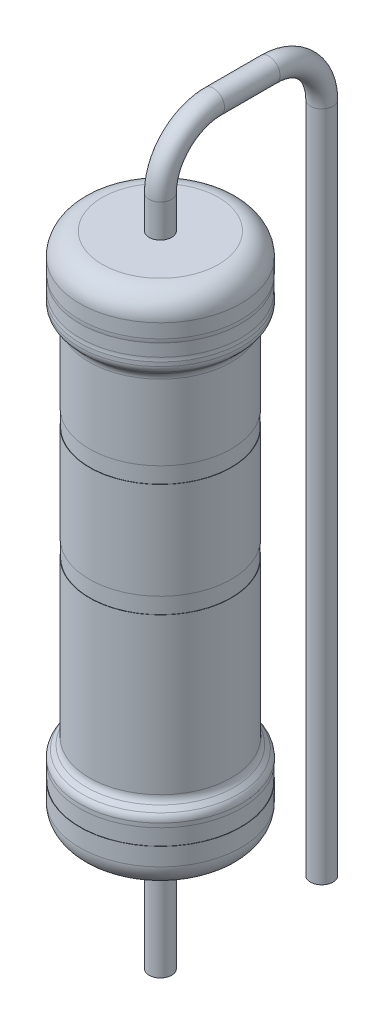
ISO-10303-21;
HEADER;
FILE_DESCRIPTION(('STEP AP214'),'2;1');
FILE_NAME('part.step','',(''),(''),'','','');
FILE_SCHEMA(('AUTOMOTIVE_DESIGN { 1 0 10303 214 1 1 1 1 }'));
ENDSEC;
DATA;
#1=APPLICATION_CONTEXT('core data for automotive mechanical design processes');
#2=APPLICATION_PROTOCOL_DEFINITION('international standard','automotive_design',2000,#1);
#3=PRODUCT_CONTEXT('',#1,'mechanical');
#4=PRODUCT('Part','Part','',(#3));
#5=PRODUCT_RELATED_PRODUCT_CATEGORY('part','',(#4));
#6=PRODUCT_DEFINITION_FORMATION('','',#4);
#7=PRODUCT_DEFINITION_CONTEXT('part definition',#1,'design');
#8=PRODUCT_DEFINITION('design','',#6,#7);
#9=PRODUCT_DEFINITION_SHAPE('','',#8);
#10=(LENGTH_UNIT() NAMED_UNIT(*) SI_UNIT(.MILLI.,.METRE.));
#11=(NAMED_UNIT(*) PLANE_ANGLE_UNIT() SI_UNIT($,.RADIAN.));
#12=(NAMED_UNIT(*) SI_UNIT($,.STERADIAN.) SOLID_ANGLE_UNIT());
#13=UNCERTAINTY_MEASURE_WITH_UNIT(LENGTH_MEASURE(1.E-05),#10,'distance_accuracy_value','');
#14=(GEOMETRIC_REPRESENTATION_CONTEXT(3) GLOBAL_UNCERTAINTY_ASSIGNED_CONTEXT((#13)) GLOBAL_UNIT_ASSIGNED_CONTEXT((#10,
#11,#12)) REPRESENTATION_CONTEXT('',''));
#15=CARTESIAN_POINT('',(0.,0.,0.));
#16=DIRECTION('',(0.,0.,1.));
#17=DIRECTION('',(1.,0.,0.));
#18=AXIS2_PLACEMENT_3D('',#15,#16,#17);
#19=CARTESIAN_POINT('',(0.,-3.8,-5.));
#20=DIRECTION('',(0.,-1.,0.));
#21=DIRECTION('',(0.,0.,-1.));
#22=AXIS2_PLACEMENT_3D('',#19,#20,#21);
#23=PLANE('',#22);
#24=CARTESIAN_POINT('',(0.,-3.8,-5.));
#25=DIRECTION('',(0.,-1.,0.));
#26=DIRECTION('',(0.,0.,-1.));
#27=AXIS2_PLACEMENT_3D('',#24,#25,#26);
#28=CIRCLE('',#27,0.35);
#29=CARTESIAN_POINT('',(0.,-3.8,-5.35));
#30=VERTEX_POINT('',#29);
#31=EDGE_CURVE('E297',#30,#30,#28,.F.);
#32=ORIENTED_EDGE('',*,*,#31,.F.);
#33=EDGE_LOOP('',(#32));
#34=FACE_BOUND('',#33,.T.);
#35=ADVANCED_FACE('F17',(#34),#23,.T.);
#36=CARTESIAN_POINT('',(0.,17.02,-5.));
#37=DIRECTION('',(0.,-1.,0.));
#38=DIRECTION('',(0.,0.,-1.));
#39=AXIS2_PLACEMENT_3D('',#36,#37,#38);
#40=CYLINDRICAL_SURFACE('',#39,0.35);
#41=ORIENTED_EDGE('',*,*,#31,.T.);
#42=EDGE_LOOP('',(#41));
#43=FACE_BOUND('',#42,.T.);
#44=CARTESIAN_POINT('',(0.,17.02,-5.));
#45=DIRECTION('',(0.,-1.,0.));
#46=DIRECTION('',(0.,0.,-1.));
#47=AXIS2_PLACEMENT_3D('',#44,#45,#46);
#48=CIRCLE('',#47,0.35);
#49=CARTESIAN_POINT('',(0.,17.02,-5.35));
#50=VERTEX_POINT('',#49);
#51=EDGE_CURVE('E299',#50,#50,#48,.F.);
#52=ORIENTED_EDGE('',*,*,#51,.F.);
#53=EDGE_LOOP('',(#52));
#54=FACE_BOUND('',#53,.T.);
#55=ADVANCED_FACE('F571',(#43,#54),#40,.T.);
#56=CARTESIAN_POINT('',(0.,17.02,-3.36));
#57=DIRECTION('',(-1.,0.,0.));
#58=DIRECTION('',(0.,0.,1.));
#59=AXIS2_PLACEMENT_3D('',#56,#57,#58);
#60=TOROIDAL_SURFACE('',#59,1.64,0.35);
#61=ORIENTED_EDGE('',*,*,#51,.T.);
#62=EDGE_LOOP('',(#61));
#63=FACE_BOUND('',#62,.T.);
#64=CARTESIAN_POINT('',(0.,18.66,-3.36));
#65=DIRECTION('',(0.,0.,-1.));
#66=DIRECTION('',(-1.,0.,0.));
#67=AXIS2_PLACEMENT_3D('',#64,#65,#66);
#68=CIRCLE('',#67,0.35);
#69=CARTESIAN_POINT('',(-0.35,18.66,-3.36));
#70=VERTEX_POINT('',#69);
#71=EDGE_CURVE('E311',#70,#70,#68,.F.);
#72=ORIENTED_EDGE('',*,*,#71,.F.);
#73=EDGE_LOOP('',(#72));
#74=FACE_BOUND('',#73,.T.);
#75=ADVANCED_FACE('F561',(#63,#74),#60,.T.);
#76=CARTESIAN_POINT('',(0.,18.66,-1.64));
#77=DIRECTION('',(0.,0.,-1.));
#78=DIRECTION('',(-1.,0.,0.));
#79=AXIS2_PLACEMENT_3D('',#76,#77,#78);
#80=CYLINDRICAL_SURFACE('',#79,0.35);
#81=CARTESIAN_POINT('',(0.,18.66,-1.64));
#82=DIRECTION('',(0.,0.,-1.));
#83=DIRECTION('',(0.,1.,0.));
#84=AXIS2_PLACEMENT_3D('',#81,#82,#83);
#85=CIRCLE('',#84,0.35);
#86=CARTESIAN_POINT('',(0.,19.01,-1.64));
#87=VERTEX_POINT('',#86);
#88=EDGE_CURVE('E316',#87,#87,#85,.F.);
#89=ORIENTED_EDGE('',*,*,#88,.F.);
#90=EDGE_LOOP('',(#89));
#91=FACE_BOUND('',#90,.T.);
#92=ORIENTED_EDGE('',*,*,#71,.T.);
#93=EDGE_LOOP('',(#92));
#94=FACE_BOUND('',#93,.T.);
#95=ADVANCED_FACE('F551',(#91,#94),#80,.T.);
#96=CARTESIAN_POINT('',(0.,17.02,-1.64));
#97=DIRECTION('',(-1.,0.,0.));
#98=DIRECTION('',(0.,0.,1.));
#99=AXIS2_PLACEMENT_3D('',#96,#97,#98);
#100=TOROIDAL_SURFACE('',#99,1.64,0.35);
#101=CARTESIAN_POINT('',(0.,17.02,0.));
#102=DIRECTION('',(0.,-1.,0.));
#103=DIRECTION('',(0.,0.,-1.));
#104=AXIS2_PLACEMENT_3D('',#101,#102,#103);
#105=CIRCLE('',#104,0.35);
#106=CARTESIAN_POINT('',(0.,17.02,-0.35));
#107=VERTEX_POINT('',#106);
#108=EDGE_CURVE('E66',#107,#107,#105,.T.);
#109=ORIENTED_EDGE('',*,*,#108,.F.);
#110=EDGE_LOOP('',(#109));
#111=FACE_BOUND('',#110,.T.);
#112=ORIENTED_EDGE('',*,*,#88,.T.);
#113=EDGE_LOOP('',(#112));
#114=FACE_BOUND('',#113,.T.);
#115=ADVANCED_FACE('F542',(#111,#114),#100,.T.);
#116=CARTESIAN_POINT('',(0.,17.02,0.));
#117=DIRECTION('',(0.,-1.,0.));
#118=DIRECTION('',(0.,0.,-1.));
#119=AXIS2_PLACEMENT_3D('',#116,#117,#118);
#120=CYLINDRICAL_SURFACE('',#119,0.35);
#121=CARTESIAN_POINT('',(0.,16.,0.));
#122=DIRECTION('',(0.,-1.,0.));
#123=DIRECTION('',(0.,0.,-1.));
#124=AXIS2_PLACEMENT_3D('',#121,#122,#123);
#125=CIRCLE('',#124,0.35);
#126=CARTESIAN_POINT('',(0.,16.,-0.35));
#127=VERTEX_POINT('',#126);
#128=EDGE_CURVE('E52',#127,#127,#125,.T.);
#129=ORIENTED_EDGE('',*,*,#128,.F.);
#130=EDGE_LOOP('',(#129));
#131=FACE_BOUND('',#130,.T.);
#132=ORIENTED_EDGE('',*,*,#108,.T.);
#133=EDGE_LOOP('',(#132));
#134=FACE_BOUND('',#133,.T.);
#135=ADVANCED_FACE('F533',(#131,#134),#120,.T.);
#136=CARTESIAN_POINT('',(0.,16.,0.));
#137=DIRECTION('',(0.,1.,0.));
#138=DIRECTION('',(0.,0.,1.));
#139=AXIS2_PLACEMENT_3D('',#136,#137,#138);
#140=PLANE('',#139);
#141=ORIENTED_EDGE('',*,*,#128,.T.);
#142=EDGE_LOOP('',(#141));
#143=FACE_BOUND('',#142,.T.);
#144=CARTESIAN_POINT('',(0.,16.,0.));
#145=DIRECTION('',(0.,-1.,0.));
#146=DIRECTION('',(0.,0.,-1.));
#147=AXIS2_PLACEMENT_3D('',#144,#145,#146);
#148=CIRCLE('',#147,1.8);
#149=CARTESIAN_POINT('',(0.,16.,-1.8));
#150=VERTEX_POINT('',#149);
#151=CARTESIAN_POINT('',(0.,16.,1.8));
#152=VERTEX_POINT('',#151);
#153=EDGE_CURVE('E45',#150,#152,#148,.T.);
#154=ORIENTED_EDGE('',*,*,#153,.F.);
#155=CARTESIAN_POINT('',(0.,16.,0.));
#156=DIRECTION('',(0.,-1.,0.));
#157=DIRECTION('',(0.,0.,1.));
#158=AXIS2_PLACEMENT_3D('',#155,#156,#157);
#159=CIRCLE('',#158,1.8);
#160=EDGE_CURVE('E50',#152,#150,#159,.T.);
#161=ORIENTED_EDGE('',*,*,#160,.F.);
#162=EDGE_LOOP('',(#154,#161));
#163=FACE_BOUND('',#162,.T.);
#164=ADVANCED_FACE('F49',(#143,#163),#140,.T.);
#165=CARTESIAN_POINT('',(0.,15.3,0.));
#166=DIRECTION('',(0.,1.,0.));
#167=DIRECTION('',(0.,0.,1.));
#168=AXIS2_PLACEMENT_3D('',#165,#166,#167);
#169=TOROIDAL_SURFACE('',#168,1.8,0.7);
#170=CARTESIAN_POINT('',(0.,15.3,0.));
#171=DIRECTION('',(0.,-1.,0.));
#172=DIRECTION('',(0.,0.,-1.));
#173=AXIS2_PLACEMENT_3D('',#170,#171,#172);
#174=CIRCLE('',#173,2.5);
#175=CARTESIAN_POINT('',(0.,15.3,-2.5));
#176=VERTEX_POINT('',#175);
#177=EDGE_CURVE('E57',#176,#176,#174,.T.);
#178=ORIENTED_EDGE('',*,*,#177,.F.);
#179=EDGE_LOOP('',(#178));
#180=FACE_BOUND('',#179,.T.);
#181=ORIENTED_EDGE('',*,*,#160,.T.);
#182=ORIENTED_EDGE('',*,*,#153,.T.);
#183=EDGE_LOOP('',(#181,#182));
#184=FACE_BOUND('',#183,.T.);
#185=ADVANCED_FACE('F56',(#180,#184),#169,.T.);
#186=CARTESIAN_POINT('',(0.,16.,0.));
#187=DIRECTION('',(0.,-1.,0.));
#188=DIRECTION('',(0.,0.,-1.));
#189=AXIS2_PLACEMENT_3D('',#186,#187,#188);
#190=CYLINDRICAL_SURFACE('',#189,2.5);
#191=ORIENTED_EDGE('',*,*,#177,.T.);
#192=EDGE_LOOP('',(#191));
#193=FACE_BOUND('',#192,.T.);
#194=CARTESIAN_POINT('',(0.,14.8678982612255,0.));
#195=DIRECTION('',(0.,-1.,0.));
#196=DIRECTION('',(0.,0.,-1.));
#197=AXIS2_PLACEMENT_3D('',#194,#195,#196);
#198=CIRCLE('',#197,2.5);
#199=CARTESIAN_POINT('',(0.,14.8678982612255,-2.5));
#200=VERTEX_POINT('',#199);
#201=EDGE_CURVE('E86',#200,#200,#198,.T.);
#202=ORIENTED_EDGE('',*,*,#201,.F.);
#203=EDGE_LOOP('',(#202));
#204=FACE_BOUND('',#203,.T.);
#205=ADVANCED_FACE('F76',(#193,#204),#190,.T.);
#206=CARTESIAN_POINT('',(0.,14.8678982612255,0.));
#207=DIRECTION('',(0.,-1.,0.));
#208=DIRECTION('',(0.,0.,-1.));
#209=AXIS2_PLACEMENT_3D('',#206,#207,#208);
#210=TOROIDAL_SURFACE('',#209,1.8,0.7);
#211=ORIENTED_EDGE('',*,*,#201,.T.);
#212=EDGE_LOOP('',(#211));
#213=FACE_BOUND('',#212,.T.);
#214=CARTESIAN_POINT('',(0.,14.75,0.));
#215=DIRECTION('',(0.,-1.,0.));
#216=DIRECTION('',(0.,0.,-1.));
#217=AXIS2_PLACEMENT_3D('',#214,#215,#216);
#218=CIRCLE('',#217,2.49);
#219=CARTESIAN_POINT('',(0.,14.75,-2.49));
#220=VERTEX_POINT('',#219);
#221=EDGE_CURVE('E89',#220,#220,#218,.T.);
#222=ORIENTED_EDGE('',*,*,#221,.F.);
#223=EDGE_LOOP('',(#222));
#224=FACE_BOUND('',#223,.T.);
#225=ADVANCED_FACE('F93',(#213,#224),#210,.T.);
#226=CARTESIAN_POINT('',(0.,0.,0.));
#227=DIRECTION('',(0.,-1.,0.));
#228=DIRECTION('',(0.,0.,-1.));
#229=AXIS2_PLACEMENT_3D('',#226,#227,#228);
#230=CYLINDRICAL_SURFACE('',#229,2.49);
#231=ORIENTED_EDGE('',*,*,#221,.T.);
#232=EDGE_LOOP('',(#231));
#233=FACE_BOUND('',#232,.T.);
#234=CARTESIAN_POINT('',(0.,14.3678982612255,0.));
#235=DIRECTION('',(0.,-1.,0.));
#236=DIRECTION('',(0.,0.,-1.));
#237=AXIS2_PLACEMENT_3D('',#234,#235,#236);
#238=CIRCLE('',#237,2.49);
#239=CARTESIAN_POINT('',(0.,14.3678982612255,-2.49));
#240=VERTEX_POINT('',#239);
#241=EDGE_CURVE('E112',#240,#240,#238,.F.);
#242=ORIENTED_EDGE('',*,*,#241,.T.);
#243=EDGE_LOOP('',(#242));
#244=FACE_BOUND('',#243,.T.);
#245=ADVANCED_FACE('F96',(#233,#244),#230,.T.);
#246=CARTESIAN_POINT('',(0.,14.3678982612255,0.));
#247=DIRECTION('',(0.,-1.,0.));
#248=DIRECTION('',(0.,0.,-1.));
#249=AXIS2_PLACEMENT_3D('',#246,#247,#248);
#250=TOROIDAL_SURFACE('',#249,3.19,0.7);
#251=ORIENTED_EDGE('',*,*,#241,.F.);
#252=EDGE_LOOP('',(#251));
#253=FACE_BOUND('',#252,.T.);
#254=CARTESIAN_POINT('',(0.,14.25,0.));
#255=DIRECTION('',(0.,-1.,0.));
#256=DIRECTION('',(0.,0.,-1.));
#257=AXIS2_PLACEMENT_3D('',#254,#255,#256);
#258=CIRCLE('',#257,2.5);
#259=CARTESIAN_POINT('',(0.,14.25,-2.5));
#260=VERTEX_POINT('',#259);
#261=EDGE_CURVE('E110',#260,#260,#258,.T.);
#262=ORIENTED_EDGE('',*,*,#261,.F.);
#263=EDGE_LOOP('',(#262));
#264=FACE_BOUND('',#263,.T.);
#265=ADVANCED_FACE('F100',(#253,#264),#250,.F.);
#266=CARTESIAN_POINT('',(0.,16.,0.));
#267=DIRECTION('',(0.,-1.,0.));
#268=DIRECTION('',(0.,0.,-1.));
#269=AXIS2_PLACEMENT_3D('',#266,#267,#268);
#270=CYLINDRICAL_SURFACE('',#269,2.5);
#271=ORIENTED_EDGE('',*,*,#261,.T.);
#272=EDGE_LOOP('',(#271));
#273=FACE_BOUND('',#272,.T.);
#274=CARTESIAN_POINT('',(0.,14.1242640687119,0.));
#275=DIRECTION('',(0.,1.,0.));
#276=DIRECTION('',(0.,0.,1.));
#277=AXIS2_PLACEMENT_3D('',#274,#275,#276);
#278=CIRCLE('',#277,2.5);
#279=CARTESIAN_POINT('',(0.,14.1242640687119,2.5));
#280=VERTEX_POINT('',#279);
#281=EDGE_CURVE('E117',#280,#280,#278,.F.);
#282=ORIENTED_EDGE('',*,*,#281,.F.);
#283=EDGE_LOOP('',(#282));
#284=FACE_BOUND('',#283,.T.);
#285=ADVANCED_FACE('F105',(#273,#284),#270,.T.);
#286=CARTESIAN_POINT('',(0.,-3.8,-5.));
#287=DIRECTION('',(0.,-1.,0.));
#288=DIRECTION('',(0.,0.,-1.));
#289=AXIS2_PLACEMENT_3D('',#286,#287,#288);
#290=PLANE('',#289);
#291=CARTESIAN_POINT('',(0.,-3.80000000000001,0.));
#292=DIRECTION('',(0.,1.,0.));
#293=DIRECTION('',(0.,0.,1.));
#294=AXIS2_PLACEMENT_3D('',#291,#292,#293);
#295=CIRCLE('',#294,0.35);
#296=CARTESIAN_POINT('',(0.,-3.80000000000001,0.35));
#297=VERTEX_POINT('',#296);
#298=EDGE_CURVE('E124',#297,#297,#295,.T.);
#299=ORIENTED_EDGE('',*,*,#298,.F.);
#300=EDGE_LOOP('',(#299));
#301=FACE_BOUND('',#300,.T.);
#302=ADVANCED_FACE('F143',(#301),#290,.T.);
#303=CARTESIAN_POINT('',(0.,14.1242640687119,0.));
#304=DIRECTION('',(0.,1.,0.));
#305=DIRECTION('',(0.,0.,1.));
#306=AXIS2_PLACEMENT_3D('',#303,#304,#305);
#307=TOROIDAL_SURFACE('',#306,2.2,0.3);
#308=CARTESIAN_POINT('',(0.,13.9121320343065,0.));
#309=DIRECTION('',(0.,1.,0.));
#310=DIRECTION('',(0.,0.,1.));
#311=AXIS2_PLACEMENT_3D('',#308,#309,#310);
#312=CIRCLE('',#311,2.41213203440793);
#313=CARTESIAN_POINT('',(0.,13.9121320343065,2.41213203440793));
#314=VERTEX_POINT('',#313);
#315=EDGE_CURVE('E128',#314,#314,#312,.F.);
#316=ORIENTED_EDGE('',*,*,#315,.F.);
#317=EDGE_LOOP('',(#316));
#318=FACE_BOUND('',#317,.T.);
#319=ORIENTED_EDGE('',*,*,#281,.T.);
#320=EDGE_LOOP('',(#319));
#321=FACE_BOUND('',#320,.T.);
#322=ADVANCED_FACE('F139',(#318,#321),#307,.T.);
#323=CARTESIAN_POINT('',(0.,-4.78994949366117,0.));
#324=DIRECTION('',(0.,1.,0.));
#325=DIRECTION('',(0.,0.,1.));
#326=AXIS2_PLACEMENT_3D('',#323,#324,#325);
#327=CYLINDRICAL_SURFACE('',#326,0.35);
#328=ORIENTED_EDGE('',*,*,#298,.T.);
#329=EDGE_LOOP('',(#328));
#330=FACE_BOUND('',#329,.T.);
#331=CARTESIAN_POINT('',(0.,0.,0.));
#332=DIRECTION('',(0.,1.,0.));
#333=DIRECTION('',(0.,0.,1.));
#334=AXIS2_PLACEMENT_3D('',#331,#332,#333);
#335=CIRCLE('',#334,0.35);
#336=CARTESIAN_POINT('',(0.,0.,0.35));
#337=VERTEX_POINT('',#336);
#338=EDGE_CURVE('E133',#337,#337,#335,.F.);
#339=ORIENTED_EDGE('',*,*,#338,.T.);
#340=EDGE_LOOP('',(#339));
#341=FACE_BOUND('',#340,.T.);
#342=ADVANCED_FACE('F142',(#330,#341),#327,.T.);
#343=CARTESIAN_POINT('',(0.,13.9121320342497,0.));
#344=DIRECTION('',(0.,1.,0.));
#345=DIRECTION('',(0.,0.,1.));
#346=AXIS2_PLACEMENT_3D('',#343,#344,#345);
#347=CONICAL_SURFACE('',#346,2.41213203435109,0.785398163397448);
#348=CARTESIAN_POINT('',(0.,13.787867965644,0.));
#349=DIRECTION('',(0.,-1.,0.));
#350=DIRECTION('',(0.,0.,-1.));
#351=AXIS2_PLACEMENT_3D('',#348,#349,#350);
#352=CIRCLE('',#351,2.28786796564404);
#353=CARTESIAN_POINT('',(0.,13.787867965644,-2.28786796564404));
#354=VERTEX_POINT('',#353);
#355=EDGE_CURVE('E136',#354,#354,#352,.F.);
#356=ORIENTED_EDGE('',*,*,#355,.T.);
#357=EDGE_LOOP('',(#356));
#358=FACE_BOUND('',#357,.T.);
#359=ORIENTED_EDGE('',*,*,#315,.T.);
#360=EDGE_LOOP('',(#359));
#361=FACE_BOUND('',#360,.T.);
#362=ADVANCED_FACE('F265',(#358,#361),#347,.T.);
#363=CARTESIAN_POINT('',(0.,0.,0.));
#364=DIRECTION('',(0.,1.,0.));
#365=DIRECTION('',(0.,0.,1.));
#366=AXIS2_PLACEMENT_3D('',#363,#364,#365);
#367=PLANE('',#366);
#368=ORIENTED_EDGE('',*,*,#338,.F.);
#369=EDGE_LOOP('',(#368));
#370=FACE_BOUND('',#369,.T.);
#371=CARTESIAN_POINT('',(0.,0.,0.));
#372=DIRECTION('',(0.,1.,0.));
#373=DIRECTION('',(0.,0.,1.));
#374=AXIS2_PLACEMENT_3D('',#371,#372,#373);
#375=CIRCLE('',#374,1.8);
#376=CARTESIAN_POINT('',(0.,0.,1.8));
#377=VERTEX_POINT('',#376);
#378=CARTESIAN_POINT('',(0.,0.,-1.8));
#379=VERTEX_POINT('',#378);
#380=EDGE_CURVE('E36',#377,#379,#375,.T.);
#381=ORIENTED_EDGE('',*,*,#380,.F.);
#382=CARTESIAN_POINT('',(0.,0.,0.));
#383=DIRECTION('',(0.,1.,0.));
#384=DIRECTION('',(0.,0.,-1.));
#385=AXIS2_PLACEMENT_3D('',#382,#383,#384);
#386=CIRCLE('',#385,1.8);
#387=EDGE_CURVE('E250',#379,#377,#386,.T.);
#388=ORIENTED_EDGE('',*,*,#387,.F.);
#389=EDGE_LOOP('',(#381,#388));
#390=FACE_BOUND('',#389,.T.);
#391=ADVANCED_FACE('F257',(#370,#390),#367,.F.);
#392=CARTESIAN_POINT('',(0.,13.5757359312881,0.));
#393=DIRECTION('',(0.,-1.,0.));
#394=DIRECTION('',(0.,0.,-1.));
#395=AXIS2_PLACEMENT_3D('',#392,#393,#394);
#396=TOROIDAL_SURFACE('',#395,2.5,0.3);
#397=ORIENTED_EDGE('',*,*,#355,.F.);
#398=EDGE_LOOP('',(#397));
#399=FACE_BOUND('',#398,.T.);
#400=CARTESIAN_POINT('',(0.,13.5757359312881,0.));
#401=DIRECTION('',(0.,-1.,0.));
#402=DIRECTION('',(0.,0.,-1.));
#403=AXIS2_PLACEMENT_3D('',#400,#401,#402);
#404=CIRCLE('',#403,2.2);
#405=CARTESIAN_POINT('',(0.,13.5757359312881,-2.2));
#406=VERTEX_POINT('',#405);
#407=EDGE_CURVE('E248',#406,#406,#404,.T.);
#408=ORIENTED_EDGE('',*,*,#407,.F.);
#409=EDGE_LOOP('',(#408));
#410=FACE_BOUND('',#409,.T.);
#411=ADVANCED_FACE('F237',(#399,#410),#396,.F.);
#412=CARTESIAN_POINT('',(0.,0.699999999999999,0.));
#413=DIRECTION('',(0.,1.,0.));
#414=DIRECTION('',(0.,0.,1.));
#415=AXIS2_PLACEMENT_3D('',#412,#413,#414);
#416=TOROIDAL_SURFACE('',#415,1.8,0.7);
#417=ORIENTED_EDGE('',*,*,#380,.T.);
#418=ORIENTED_EDGE('',*,*,#387,.T.);
#419=EDGE_LOOP('',(#417,#418));
#420=FACE_BOUND('',#419,.T.);
#421=CARTESIAN_POINT('',(0.,0.699999999999999,0.));
#422=DIRECTION('',(0.,-1.,0.));
#423=DIRECTION('',(0.,0.,-1.));
#424=AXIS2_PLACEMENT_3D('',#421,#422,#423);
#425=CIRCLE('',#424,2.5);
#426=CARTESIAN_POINT('',(0.,0.699999999999999,-2.5));
#427=VERTEX_POINT('',#426);
#428=EDGE_CURVE('E244',#427,#427,#425,.F.);
#429=ORIENTED_EDGE('',*,*,#428,.F.);
#430=EDGE_LOOP('',(#429));
#431=FACE_BOUND('',#430,.T.);
#432=ADVANCED_FACE('F232',(#420,#431),#416,.T.);
#433=CARTESIAN_POINT('',(0.,0.,0.));
#434=DIRECTION('',(0.,-1.,0.));
#435=DIRECTION('',(0.,0.,-1.));
#436=AXIS2_PLACEMENT_3D('',#433,#434,#435);
#437=CYLINDRICAL_SURFACE('',#436,2.2);
#438=ORIENTED_EDGE('',*,*,#407,.T.);
#439=EDGE_LOOP('',(#438));
#440=FACE_BOUND('',#439,.T.);
#441=CARTESIAN_POINT('',(0.,11.25,0.));
#442=DIRECTION('',(0.,-1.,0.));
#443=DIRECTION('',(0.,0.,-1.));
#444=AXIS2_PLACEMENT_3D('',#441,#442,#443);
#445=CIRCLE('',#444,2.2);
#446=CARTESIAN_POINT('',(0.,11.25,-2.2));
#447=VERTEX_POINT('',#446);
#448=EDGE_CURVE('E247',#447,#447,#445,.T.);
#449=ORIENTED_EDGE('',*,*,#448,.F.);
#450=EDGE_LOOP('',(#449));
#451=FACE_BOUND('',#450,.T.);
#452=ADVANCED_FACE('F228',(#440,#451),#437,.T.);
#453=CARTESIAN_POINT('',(0.,16.,0.));
#454=DIRECTION('',(0.,-1.,0.));
#455=DIRECTION('',(0.,0.,-1.));
#456=AXIS2_PLACEMENT_3D('',#453,#454,#455);
#457=CYLINDRICAL_SURFACE('',#456,2.5);
#458=CARTESIAN_POINT('',(0.,1.25,0.));
#459=DIRECTION('',(0.,-1.,0.));
#460=DIRECTION('',(0.,0.,-1.));
#461=AXIS2_PLACEMENT_3D('',#458,#459,#460);
#462=CIRCLE('',#461,2.5);
#463=CARTESIAN_POINT('',(0.,1.25,-2.5));
#464=VERTEX_POINT('',#463);
#465=EDGE_CURVE('E347',#464,#464,#462,.F.);
#466=ORIENTED_EDGE('',*,*,#465,.F.);
#467=EDGE_LOOP('',(#466));
#468=FACE_BOUND('',#467,.T.);
#469=ORIENTED_EDGE('',*,*,#428,.T.);
#470=EDGE_LOOP('',(#469));
#471=FACE_BOUND('',#470,.T.);
#472=ADVANCED_FACE('F224',(#468,#471),#457,.T.);
#473=CARTESIAN_POINT('',(-2.2,11.25,0.));
#474=DIRECTION('',(0.,-1.,0.));
#475=DIRECTION('',(0.,0.,-1.));
#476=AXIS2_PLACEMENT_3D('',#473,#474,#475);
#477=PLANE('',#476);
#478=CARTESIAN_POINT('',(0.,11.25,0.));
#479=DIRECTION('',(0.,-1.,0.));
#480=DIRECTION('',(0.,0.,-1.));
#481=AXIS2_PLACEMENT_3D('',#478,#479,#480);
#482=CIRCLE('',#481,2.19);
#483=CARTESIAN_POINT('',(0.,11.25,-2.19));
#484=VERTEX_POINT('',#483);
#485=EDGE_CURVE('E345',#484,#484,#482,.T.);
#486=ORIENTED_EDGE('',*,*,#485,.F.);
#487=EDGE_LOOP('',(#486));
#488=FACE_BOUND('',#487,.T.);
#489=ORIENTED_EDGE('',*,*,#448,.T.);
#490=EDGE_LOOP('',(#489));
#491=FACE_BOUND('',#490,.T.);
#492=ADVANCED_FACE('F220',(#488,#491),#477,.T.);
#493=CARTESIAN_POINT('',(-2.49,1.25,0.));
#494=DIRECTION('',(0.,1.,0.));
#495=DIRECTION('',(0.,0.,1.));
#496=AXIS2_PLACEMENT_3D('',#493,#494,#495);
#497=PLANE('',#496);
#498=ORIENTED_EDGE('',*,*,#465,.T.);
#499=EDGE_LOOP('',(#498));
#500=FACE_BOUND('',#499,.T.);
#501=CARTESIAN_POINT('',(0.,1.25,0.));
#502=DIRECTION('',(0.,-1.,0.));
#503=DIRECTION('',(0.,0.,-1.));
#504=AXIS2_PLACEMENT_3D('',#501,#502,#503);
#505=CIRCLE('',#504,2.49);
#506=CARTESIAN_POINT('',(0.,1.25,-2.49));
#507=VERTEX_POINT('',#506);
#508=EDGE_CURVE('E342',#507,#507,#505,.F.);
#509=ORIENTED_EDGE('',*,*,#508,.F.);
#510=EDGE_LOOP('',(#509));
#511=FACE_BOUND('',#510,.T.);
#512=ADVANCED_FACE('F216',(#500,#511),#497,.T.);
#513=CARTESIAN_POINT('',(0.,0.,0.));
#514=DIRECTION('',(0.,-1.,0.));
#515=DIRECTION('',(0.,0.,-1.));
#516=AXIS2_PLACEMENT_3D('',#513,#514,#515);
#517=CYLINDRICAL_SURFACE('',#516,2.19);
#518=ORIENTED_EDGE('',*,*,#485,.T.);
#519=EDGE_LOOP('',(#518));
#520=FACE_BOUND('',#519,.T.);
#521=CARTESIAN_POINT('',(0.,10.75,0.));
#522=DIRECTION('',(0.,-1.,0.));
#523=DIRECTION('',(0.,0.,-1.));
#524=AXIS2_PLACEMENT_3D('',#521,#522,#523);
#525=CIRCLE('',#524,2.19);
#526=CARTESIAN_POINT('',(0.,10.75,-2.19));
#527=VERTEX_POINT('',#526);
#528=EDGE_CURVE('E339',#527,#527,#525,.T.);
#529=ORIENTED_EDGE('',*,*,#528,.F.);
#530=EDGE_LOOP('',(#529));
#531=FACE_BOUND('',#530,.T.);
#532=ADVANCED_FACE('F212',(#520,#531),#517,.T.);
#533=CARTESIAN_POINT('',(0.,0.,0.));
#534=DIRECTION('',(0.,-1.,0.));
#535=DIRECTION('',(0.,0.,-1.));
#536=AXIS2_PLACEMENT_3D('',#533,#534,#535);
#537=CYLINDRICAL_SURFACE('',#536,2.49);
#538=CARTESIAN_POINT('',(0.,1.75,0.));
#539=DIRECTION('',(0.,-1.,0.));
#540=DIRECTION('',(0.,0.,-1.));
#541=AXIS2_PLACEMENT_3D('',#538,#539,#540);
#542=CIRCLE('',#541,2.49);
#543=CARTESIAN_POINT('',(0.,1.75,-2.49));
#544=VERTEX_POINT('',#543);
#545=EDGE_CURVE('E336',#544,#544,#542,.F.);
#546=ORIENTED_EDGE('',*,*,#545,.F.);
#547=EDGE_LOOP('',(#546));
#548=FACE_BOUND('',#547,.T.);
#549=ORIENTED_EDGE('',*,*,#508,.T.);
#550=EDGE_LOOP('',(#549));
#551=FACE_BOUND('',#550,.T.);
#552=ADVANCED_FACE('F208',(#548,#551),#537,.T.);
#553=CARTESIAN_POINT('',(-2.19,10.75,0.));
#554=DIRECTION('',(0.,1.,0.));
#555=DIRECTION('',(0.,0.,1.));
#556=AXIS2_PLACEMENT_3D('',#553,#554,#555);
#557=PLANE('',#556);
#558=CARTESIAN_POINT('',(0.,10.75,0.));
#559=DIRECTION('',(0.,-1.,0.));
#560=DIRECTION('',(0.,0.,-1.));
#561=AXIS2_PLACEMENT_3D('',#558,#559,#560);
#562=CIRCLE('',#561,2.2);
#563=CARTESIAN_POINT('',(0.,10.75,-2.2));
#564=VERTEX_POINT('',#563);
#565=EDGE_CURVE('E333',#564,#564,#562,.T.);
#566=ORIENTED_EDGE('',*,*,#565,.F.);
#567=EDGE_LOOP('',(#566));
#568=FACE_BOUND('',#567,.T.);
#569=ORIENTED_EDGE('',*,*,#528,.T.);
#570=EDGE_LOOP('',(#569));
#571=FACE_BOUND('',#570,.T.);
#572=ADVANCED_FACE('F204',(#568,#571),#557,.T.);
#573=CARTESIAN_POINT('',(-2.5,1.75,0.));
#574=DIRECTION('',(0.,-1.,0.));
#575=DIRECTION('',(0.,0.,-1.));
#576=AXIS2_PLACEMENT_3D('',#573,#574,#575);
#577=PLANE('',#576);
#578=ORIENTED_EDGE('',*,*,#545,.T.);
#579=EDGE_LOOP('',(#578));
#580=FACE_BOUND('',#579,.T.);
#581=CARTESIAN_POINT('',(0.,1.75,0.));
#582=DIRECTION('',(0.,-1.,0.));
#583=DIRECTION('',(0.,0.,-1.));
#584=AXIS2_PLACEMENT_3D('',#581,#582,#583);
#585=CIRCLE('',#584,2.5);
#586=CARTESIAN_POINT('',(0.,1.75,-2.5));
#587=VERTEX_POINT('',#586);
#588=EDGE_CURVE('E330',#587,#587,#585,.F.);
#589=ORIENTED_EDGE('',*,*,#588,.F.);
#590=EDGE_LOOP('',(#589));
#591=FACE_BOUND('',#590,.T.);
#592=ADVANCED_FACE('F200',(#580,#591),#577,.T.);
#593=CARTESIAN_POINT('',(0.,0.,0.));
#594=DIRECTION('',(0.,-1.,0.));
#595=DIRECTION('',(0.,0.,-1.));
#596=AXIS2_PLACEMENT_3D('',#593,#594,#595);
#597=CYLINDRICAL_SURFACE('',#596,2.2);
#598=ORIENTED_EDGE('',*,*,#565,.T.);
#599=EDGE_LOOP('',(#598));
#600=FACE_BOUND('',#599,.T.);
#601=CARTESIAN_POINT('',(0.,7.75,0.));
#602=DIRECTION('',(0.,-1.,0.));
#603=DIRECTION('',(0.,0.,-1.));
#604=AXIS2_PLACEMENT_3D('',#601,#602,#603);
#605=CIRCLE('',#604,2.2);
#606=CARTESIAN_POINT('',(0.,7.75,-2.2));
#607=VERTEX_POINT('',#606);
#608=EDGE_CURVE('E327',#607,#607,#605,.T.);
#609=ORIENTED_EDGE('',*,*,#608,.F.);
#610=EDGE_LOOP('',(#609));
#611=FACE_BOUND('',#610,.T.);
#612=ADVANCED_FACE('F196',(#600,#611),#597,.T.);
#613=CARTESIAN_POINT('',(0.,16.,0.));
#614=DIRECTION('',(0.,-1.,0.));
#615=DIRECTION('',(0.,0.,-1.));
#616=AXIS2_PLACEMENT_3D('',#613,#614,#615);
#617=CYLINDRICAL_SURFACE('',#616,2.5);
#618=ORIENTED_EDGE('',*,*,#588,.T.);
#619=EDGE_LOOP('',(#618));
#620=FACE_BOUND('',#619,.T.);
#621=CARTESIAN_POINT('',(0.,1.87573593128807,0.));
#622=DIRECTION('',(0.,1.,0.));
#623=DIRECTION('',(0.,0.,1.));
#624=AXIS2_PLACEMENT_3D('',#621,#622,#623);
#625=CIRCLE('',#624,2.5);
#626=CARTESIAN_POINT('',(0.,1.87573593128807,2.5));
#627=VERTEX_POINT('',#626);
#628=EDGE_CURVE('E180',#627,#627,#625,.T.);
#629=ORIENTED_EDGE('',*,*,#628,.F.);
#630=EDGE_LOOP('',(#629));
#631=FACE_BOUND('',#630,.T.);
#632=ADVANCED_FACE('F192',(#620,#631),#617,.T.);
#633=CARTESIAN_POINT('',(-2.2,7.75,0.));
#634=DIRECTION('',(0.,-1.,0.));
#635=DIRECTION('',(0.,0.,-1.));
#636=AXIS2_PLACEMENT_3D('',#633,#634,#635);
#637=PLANE('',#636);
#638=CARTESIAN_POINT('',(0.,7.75,0.));
#639=DIRECTION('',(0.,-1.,0.));
#640=DIRECTION('',(0.,0.,-1.));
#641=AXIS2_PLACEMENT_3D('',#638,#639,#640);
#642=CIRCLE('',#641,2.19);
#643=CARTESIAN_POINT('',(0.,7.75,-2.19));
#644=VERTEX_POINT('',#643);
#645=EDGE_CURVE('E177',#644,#644,#642,.T.);
#646=ORIENTED_EDGE('',*,*,#645,.F.);
#647=EDGE_LOOP('',(#646));
#648=FACE_BOUND('',#647,.T.);
#649=ORIENTED_EDGE('',*,*,#608,.T.);
#650=EDGE_LOOP('',(#649));
#651=FACE_BOUND('',#650,.T.);
#652=ADVANCED_FACE('F188',(#648,#651),#637,.T.);
#653=CARTESIAN_POINT('',(0.,1.87573593128807,0.));
#654=DIRECTION('',(0.,1.,0.));
#655=DIRECTION('',(0.,0.,1.));
#656=AXIS2_PLACEMENT_3D('',#653,#654,#655);
#657=TOROIDAL_SURFACE('',#656,2.2,0.3);
#658=CARTESIAN_POINT('',(0.,2.08786796565619,0.));
#659=DIRECTION('',(0.,-1.,0.));
#660=DIRECTION('',(0.,0.,-1.));
#661=AXIS2_PLACEMENT_3D('',#658,#659,#660);
#662=CIRCLE('',#661,2.41213203435109);
#663=CARTESIAN_POINT('',(0.,2.08786796565619,-2.41213203435109));
#664=VERTEX_POINT('',#663);
#665=EDGE_CURVE('E174',#664,#664,#662,.F.);
#666=ORIENTED_EDGE('',*,*,#665,.F.);
#667=EDGE_LOOP('',(#666));
#668=FACE_BOUND('',#667,.T.);
#669=ORIENTED_EDGE('',*,*,#628,.T.);
#670=EDGE_LOOP('',(#669));
#671=FACE_BOUND('',#670,.T.);
#672=ADVANCED_FACE('F183',(#668,#671),#657,.T.);
#673=CARTESIAN_POINT('',(0.,0.,0.));
#674=DIRECTION('',(0.,-1.,0.));
#675=DIRECTION('',(0.,0.,-1.));
#676=AXIS2_PLACEMENT_3D('',#673,#674,#675);
#677=CYLINDRICAL_SURFACE('',#676,2.19);
#678=ORIENTED_EDGE('',*,*,#645,.T.);
#679=EDGE_LOOP('',(#678));
#680=FACE_BOUND('',#679,.T.);
#681=CARTESIAN_POINT('',(0.,7.25,0.));
#682=DIRECTION('',(0.,-1.,0.));
#683=DIRECTION('',(0.,0.,-1.));
#684=AXIS2_PLACEMENT_3D('',#681,#682,#683);
#685=CIRCLE('',#684,2.19);
#686=CARTESIAN_POINT('',(0.,7.25,-2.19));
#687=VERTEX_POINT('',#686);
#688=EDGE_CURVE('E173',#687,#687,#685,.T.);
#689=ORIENTED_EDGE('',*,*,#688,.F.);
#690=EDGE_LOOP('',(#689));
#691=FACE_BOUND('',#690,.T.);
#692=ADVANCED_FACE('F187',(#680,#691),#677,.T.);
#693=CARTESIAN_POINT('',(0.,2.08786796565619,0.));
#694=DIRECTION('',(0.,-1.,0.));
#695=DIRECTION('',(0.,0.,-1.));
#696=AXIS2_PLACEMENT_3D('',#693,#694,#695);
#697=CONICAL_SURFACE('',#696,2.41213203435109,0.785398163168728);
#698=ORIENTED_EDGE('',*,*,#665,.T.);
#699=EDGE_LOOP('',(#698));
#700=FACE_BOUND('',#699,.T.);
#701=CARTESIAN_POINT('',(0.,2.21213203435596,0.));
#702=DIRECTION('',(0.,-1.,0.));
#703=DIRECTION('',(0.,0.,-1.));
#704=AXIS2_PLACEMENT_3D('',#701,#702,#703);
#705=CIRCLE('',#704,2.28786796564404);
#706=CARTESIAN_POINT('',(0.,2.21213203435596,-2.28786796564404));
#707=VERTEX_POINT('',#706);
#708=EDGE_CURVE('E170',#707,#707,#705,.T.);
#709=ORIENTED_EDGE('',*,*,#708,.T.);
#710=EDGE_LOOP('',(#709));
#711=FACE_BOUND('',#710,.T.);
#712=ADVANCED_FACE('F378',(#700,#711),#697,.T.);
#713=CARTESIAN_POINT('',(-2.19,7.25,0.));
#714=DIRECTION('',(0.,1.,0.));
#715=DIRECTION('',(0.,0.,1.));
#716=AXIS2_PLACEMENT_3D('',#713,#714,#715);
#717=PLANE('',#716);
#718=CARTESIAN_POINT('',(0.,7.25,0.));
#719=DIRECTION('',(0.,-1.,0.));
#720=DIRECTION('',(0.,0.,-1.));
#721=AXIS2_PLACEMENT_3D('',#718,#719,#720);
#722=CIRCLE('',#721,2.2);
#723=CARTESIAN_POINT('',(0.,7.25,-2.2));
#724=VERTEX_POINT('',#723);
#725=EDGE_CURVE('E28',#724,#724,#722,.T.);
#726=ORIENTED_EDGE('',*,*,#725,.F.);
#727=EDGE_LOOP('',(#726));
#728=FACE_BOUND('',#727,.T.);
#729=ORIENTED_EDGE('',*,*,#688,.T.);
#730=EDGE_LOOP('',(#729));
#731=FACE_BOUND('',#730,.T.);
#732=ADVANCED_FACE('F161',(#728,#731),#717,.T.);
#733=CARTESIAN_POINT('',(0.,2.42426406871193,0.));
#734=DIRECTION('',(0.,-1.,0.));
#735=DIRECTION('',(0.,0.,-1.));
#736=AXIS2_PLACEMENT_3D('',#733,#734,#735);
#737=TOROIDAL_SURFACE('',#736,2.5,0.3);
#738=ORIENTED_EDGE('',*,*,#708,.F.);
#739=EDGE_LOOP('',(#738));
#740=FACE_BOUND('',#739,.T.);
#741=CARTESIAN_POINT('',(0.,2.42426406871193,0.));
#742=DIRECTION('',(0.,-1.,0.));
#743=DIRECTION('',(0.,0.,-1.));
#744=AXIS2_PLACEMENT_3D('',#741,#742,#743);
#745=CIRCLE('',#744,2.2);
#746=CARTESIAN_POINT('',(0.,2.42426406871193,-2.2));
#747=VERTEX_POINT('',#746);
#748=EDGE_CURVE('E11',#747,#747,#745,.F.);
#749=ORIENTED_EDGE('',*,*,#748,.F.);
#750=EDGE_LOOP('',(#749));
#751=FACE_BOUND('',#750,.T.);
#752=ADVANCED_FACE('F155',(#740,#751),#737,.F.);
#753=CARTESIAN_POINT('',(0.,0.,0.));
#754=DIRECTION('',(0.,-1.,0.));
#755=DIRECTION('',(0.,0.,-1.));
#756=AXIS2_PLACEMENT_3D('',#753,#754,#755);
#757=CYLINDRICAL_SURFACE('',#756,2.2);
#758=ORIENTED_EDGE('',*,*,#748,.T.);
#759=EDGE_LOOP('',(#758));
#760=FACE_BOUND('',#759,.T.);
#761=ORIENTED_EDGE('',*,*,#725,.T.);
#762=EDGE_LOOP('',(#761));
#763=FACE_BOUND('',#762,.T.);
#764=ADVANCED_FACE('F153',(#760,#763),#757,.T.);
#765=CLOSED_SHELL('',(#35,#55,#75,#95,#115,#135,#164,#185,#205,#225,#245,#265,#285,#302,#322,
#342,#362,#391,#411,#432,#452,#472,#492,#512,#532,#552,#572,#592,#612,#632,#652,#672,#692,#712,
#732,#752,#764));
#766=MANIFOLD_SOLID_BREP('B1',#765);
#767=ADVANCED_BREP_SHAPE_REPRESENTATION('',(#18,#766),#14);
#768=SHAPE_DEFINITION_REPRESENTATION(#9,#767);
ENDSEC;
END-ISO-10303-21;
